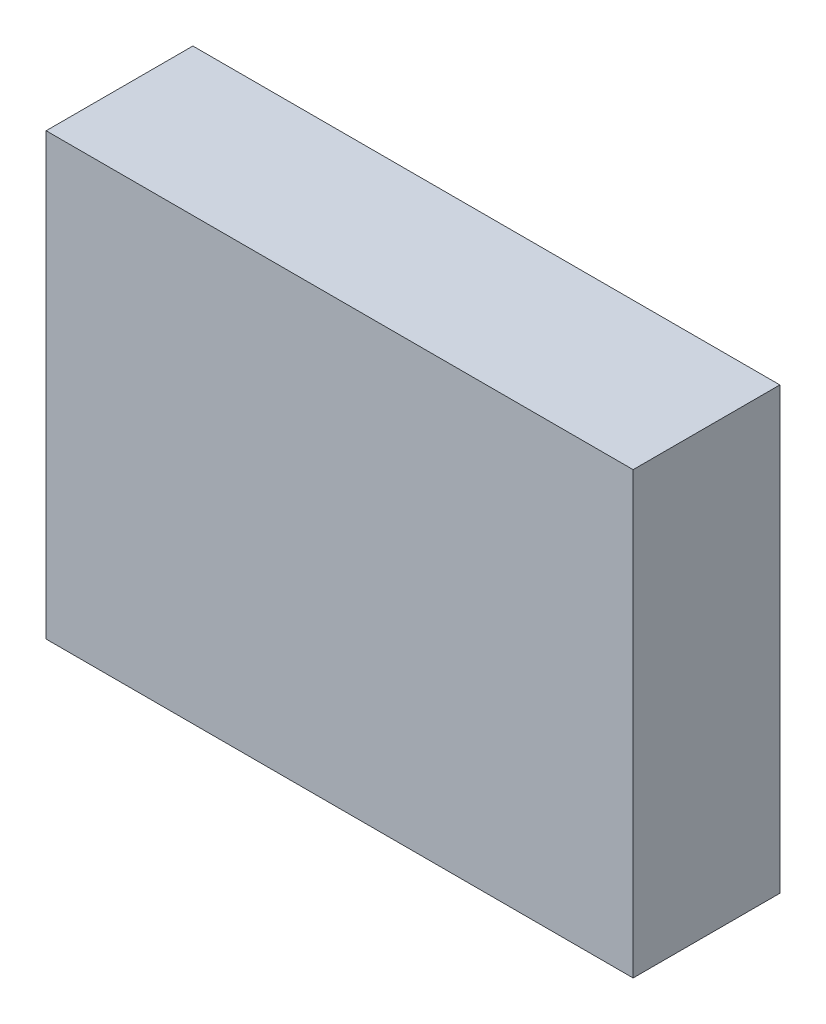
ISO-10303-21;
HEADER;
FILE_DESCRIPTION(('STEP AP214'),'2;1');
FILE_NAME('part.step','',(''),(''),'','','');
FILE_SCHEMA(('AUTOMOTIVE_DESIGN { 1 0 10303 214 1 1 1 1 }'));
ENDSEC;
DATA;
#1=APPLICATION_CONTEXT('core data for automotive mechanical design processes');
#2=APPLICATION_PROTOCOL_DEFINITION('international standard','automotive_design',2000,#1);
#3=PRODUCT_CONTEXT('',#1,'mechanical');
#4=PRODUCT('Part','Part','',(#3));
#5=PRODUCT_RELATED_PRODUCT_CATEGORY('part','',(#4));
#6=PRODUCT_DEFINITION_FORMATION('','',#4);
#7=PRODUCT_DEFINITION_CONTEXT('part definition',#1,'design');
#8=PRODUCT_DEFINITION('design','',#6,#7);
#9=PRODUCT_DEFINITION_SHAPE('','',#8);
#10=(LENGTH_UNIT() NAMED_UNIT(*) SI_UNIT(.MILLI.,.METRE.));
#11=(NAMED_UNIT(*) PLANE_ANGLE_UNIT() SI_UNIT($,.RADIAN.));
#12=(NAMED_UNIT(*) SI_UNIT($,.STERADIAN.) SOLID_ANGLE_UNIT());
#13=UNCERTAINTY_MEASURE_WITH_UNIT(LENGTH_MEASURE(1.E-05),#10,'distance_accuracy_value','');
#14=(GEOMETRIC_REPRESENTATION_CONTEXT(3) GLOBAL_UNCERTAINTY_ASSIGNED_CONTEXT((#13)) GLOBAL_UNIT_ASSIGNED_CONTEXT((#10,
#11,#12)) REPRESENTATION_CONTEXT('',''));
#15=CARTESIAN_POINT('',(0.,0.,0.));
#16=DIRECTION('',(0.,0.,1.));
#17=DIRECTION('',(1.,0.,0.));
#18=AXIS2_PLACEMENT_3D('',#15,#16,#17);
#19=CARTESIAN_POINT('',(40.,-30.,20.));
#20=DIRECTION('',(-1.,0.,0.));
#21=DIRECTION('',(0.,0.,1.));
#22=AXIS2_PLACEMENT_3D('',#19,#20,#21);
#23=PLANE('',#22);
#24=DIRECTION('',(0.,1.,0.));
#25=VECTOR('',#24,1.);
#26=CARTESIAN_POINT('',(40.,-30.,0.));
#27=LINE('',#26,#25);
#28=CARTESIAN_POINT('',(40.,-30.,0.));
#29=VERTEX_POINT('',#28);
#30=CARTESIAN_POINT('',(40.,30.,0.));
#31=VERTEX_POINT('',#30);
#32=EDGE_CURVE('E113',#29,#31,#27,.T.);
#33=ORIENTED_EDGE('',*,*,#32,.T.);
#34=DIRECTION('',(0.,0.,-1.));
#35=VECTOR('',#34,1.);
#36=CARTESIAN_POINT('',(40.,30.,20.));
#37=LINE('',#36,#35);
#38=CARTESIAN_POINT('',(40.,30.,20.));
#39=VERTEX_POINT('',#38);
#40=EDGE_CURVE('E11',#39,#31,#37,.T.);
#41=ORIENTED_EDGE('',*,*,#40,.F.);
#42=DIRECTION('',(0.,1.,0.));
#43=VECTOR('',#42,1.);
#44=CARTESIAN_POINT('',(40.,-30.,20.));
#45=LINE('',#44,#43);
#46=CARTESIAN_POINT('',(40.,-30.,20.));
#47=VERTEX_POINT('',#46);
#48=EDGE_CURVE('E97',#47,#39,#45,.T.);
#49=ORIENTED_EDGE('',*,*,#48,.F.);
#50=DIRECTION('',(0.,0.,-1.));
#51=VECTOR('',#50,1.);
#52=CARTESIAN_POINT('',(40.,-30.,20.));
#53=LINE('',#52,#51);
#54=EDGE_CURVE('E109',#47,#29,#53,.T.);
#55=ORIENTED_EDGE('',*,*,#54,.T.);
#56=EDGE_LOOP('',(#33,#41,#49,#55));
#57=FACE_BOUND('',#56,.T.);
#58=ADVANCED_FACE('F45',(#57),#23,.F.);
#59=CARTESIAN_POINT('',(-40.,30.,20.));
#60=DIRECTION('',(0.,-1.,0.));
#61=DIRECTION('',(0.,0.,-1.));
#62=AXIS2_PLACEMENT_3D('',#59,#60,#61);
#63=PLANE('',#62);
#64=DIRECTION('',(-1.,0.,0.));
#65=VECTOR('',#64,1.);
#66=CARTESIAN_POINT('',(-40.,30.,0.));
#67=LINE('',#66,#65);
#68=CARTESIAN_POINT('',(-40.,30.,0.));
#69=VERTEX_POINT('',#68);
#70=EDGE_CURVE('E102',#31,#69,#67,.T.);
#71=ORIENTED_EDGE('',*,*,#70,.T.);
#72=DIRECTION('',(0.,0.,-1.));
#73=VECTOR('',#72,1.);
#74=CARTESIAN_POINT('',(-40.,30.,20.));
#75=LINE('',#74,#73);
#76=CARTESIAN_POINT('',(-40.,30.,20.));
#77=VERTEX_POINT('',#76);
#78=EDGE_CURVE('E54',#77,#69,#75,.T.);
#79=ORIENTED_EDGE('',*,*,#78,.F.);
#80=DIRECTION('',(-1.,0.,0.));
#81=VECTOR('',#80,1.);
#82=CARTESIAN_POINT('',(-40.,30.,20.));
#83=LINE('',#82,#81);
#84=EDGE_CURVE('E92',#39,#77,#83,.T.);
#85=ORIENTED_EDGE('',*,*,#84,.F.);
#86=ORIENTED_EDGE('',*,*,#40,.T.);
#87=EDGE_LOOP('',(#71,#79,#85,#86));
#88=FACE_BOUND('',#87,.T.);
#89=ADVANCED_FACE('F101',(#88),#63,.F.);
#90=CARTESIAN_POINT('',(-40.,-30.,20.));
#91=DIRECTION('',(1.,0.,0.));
#92=DIRECTION('',(0.,0.,-1.));
#93=AXIS2_PLACEMENT_3D('',#90,#91,#92);
#94=PLANE('',#93);
#95=DIRECTION('',(0.,-1.,0.));
#96=VECTOR('',#95,1.);
#97=CARTESIAN_POINT('',(-40.,-30.,0.));
#98=LINE('',#97,#96);
#99=CARTESIAN_POINT('',(-40.,-30.,0.));
#100=VERTEX_POINT('',#99);
#101=EDGE_CURVE('E79',#69,#100,#98,.T.);
#102=ORIENTED_EDGE('',*,*,#101,.T.);
#103=DIRECTION('',(0.,0.,-1.));
#104=VECTOR('',#103,1.);
#105=CARTESIAN_POINT('',(-40.,-30.,20.));
#106=LINE('',#105,#104);
#107=CARTESIAN_POINT('',(-40.,-30.,20.));
#108=VERTEX_POINT('',#107);
#109=EDGE_CURVE('E104',#108,#100,#106,.T.);
#110=ORIENTED_EDGE('',*,*,#109,.F.);
#111=DIRECTION('',(0.,-1.,0.));
#112=VECTOR('',#111,1.);
#113=CARTESIAN_POINT('',(-40.,-30.,20.));
#114=LINE('',#113,#112);
#115=EDGE_CURVE('E95',#77,#108,#114,.T.);
#116=ORIENTED_EDGE('',*,*,#115,.F.);
#117=ORIENTED_EDGE('',*,*,#78,.T.);
#118=EDGE_LOOP('',(#102,#110,#116,#117));
#119=FACE_BOUND('',#118,.T.);
#120=ADVANCED_FACE('F105',(#119),#94,.F.);
#121=CARTESIAN_POINT('',(-40.,-30.,20.));
#122=DIRECTION('',(0.,1.,0.));
#123=DIRECTION('',(0.,0.,1.));
#124=AXIS2_PLACEMENT_3D('',#121,#122,#123);
#125=PLANE('',#124);
#126=DIRECTION('',(1.,0.,0.));
#127=VECTOR('',#126,1.);
#128=CARTESIAN_POINT('',(-40.,-30.,0.));
#129=LINE('',#128,#127);
#130=EDGE_CURVE('E85',#100,#29,#129,.T.);
#131=ORIENTED_EDGE('',*,*,#130,.T.);
#132=ORIENTED_EDGE('',*,*,#54,.F.);
#133=DIRECTION('',(1.,0.,0.));
#134=VECTOR('',#133,1.);
#135=CARTESIAN_POINT('',(-40.,-30.,20.));
#136=LINE('',#135,#134);
#137=EDGE_CURVE('E62',#108,#47,#136,.T.);
#138=ORIENTED_EDGE('',*,*,#137,.F.);
#139=ORIENTED_EDGE('',*,*,#109,.T.);
#140=EDGE_LOOP('',(#131,#132,#138,#139));
#141=FACE_BOUND('',#140,.T.);
#142=ADVANCED_FACE('F126',(#141),#125,.F.);
#143=CARTESIAN_POINT('',(0.,0.,20.));
#144=DIRECTION('',(0.,0.,-1.));
#145=DIRECTION('',(-1.,0.,0.));
#146=AXIS2_PLACEMENT_3D('',#143,#144,#145);
#147=PLANE('',#146);
#148=ORIENTED_EDGE('',*,*,#48,.T.);
#149=ORIENTED_EDGE('',*,*,#84,.T.);
#150=ORIENTED_EDGE('',*,*,#115,.T.);
#151=ORIENTED_EDGE('',*,*,#137,.T.);
#152=EDGE_LOOP('',(#148,#149,#150,#151));
#153=FACE_BOUND('',#152,.T.);
#154=ADVANCED_FACE('F93',(#153),#147,.F.);
#155=CARTESIAN_POINT('',(0.,0.,0.));
#156=DIRECTION('',(0.,0.,-1.));
#157=DIRECTION('',(-1.,0.,0.));
#158=AXIS2_PLACEMENT_3D('',#155,#156,#157);
#159=PLANE('',#158);
#160=ORIENTED_EDGE('',*,*,#32,.F.);
#161=ORIENTED_EDGE('',*,*,#130,.F.);
#162=ORIENTED_EDGE('',*,*,#101,.F.);
#163=ORIENTED_EDGE('',*,*,#70,.F.);
#164=EDGE_LOOP('',(#160,#161,#162,#163));
#165=FACE_BOUND('',#164,.T.);
#166=ADVANCED_FACE('F129',(#165),#159,.T.);
#167=CLOSED_SHELL('',(#58,#89,#120,#142,#154,#166));
#168=MANIFOLD_SOLID_BREP('B2',#167);
#169=ADVANCED_BREP_SHAPE_REPRESENTATION('',(#18,#168),#14);
#170=SHAPE_DEFINITION_REPRESENTATION(#9,#169);
ENDSEC;
END-ISO-10303-21;
